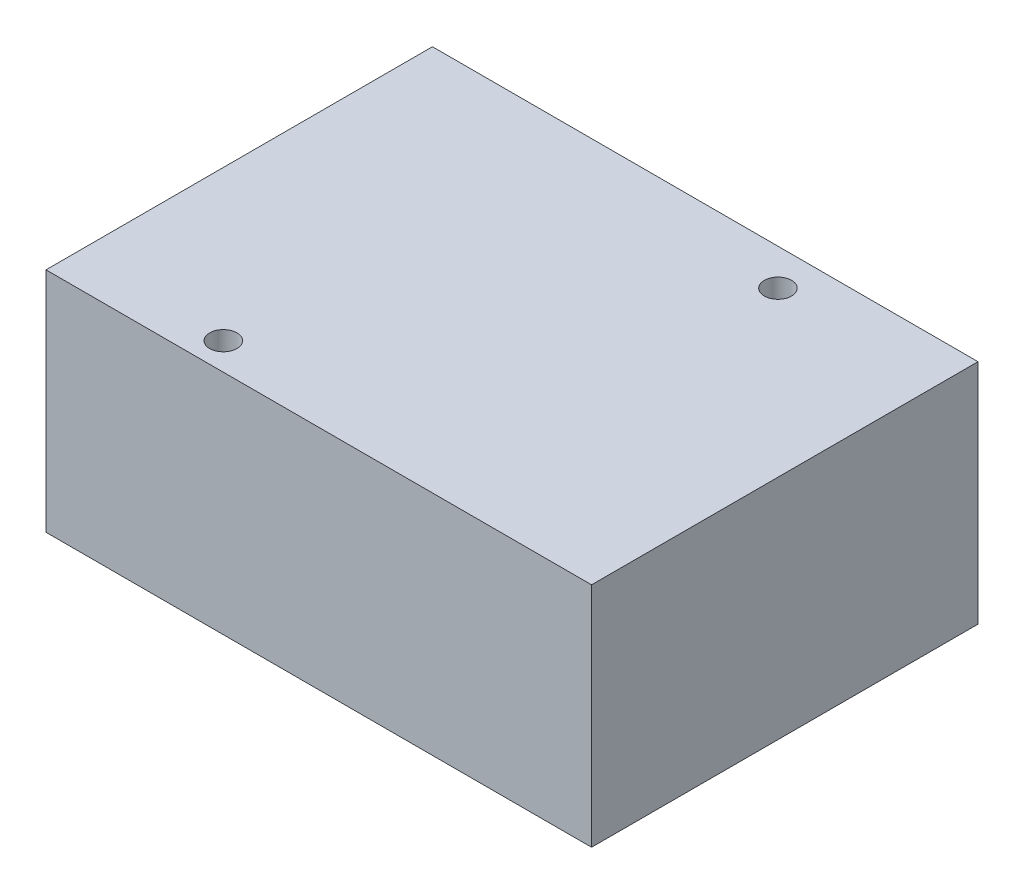
ISO-10303-21;
HEADER;
FILE_DESCRIPTION(('STEP AP214'),'2;1');
FILE_NAME('part.step','',(''),(''),'','','');
FILE_SCHEMA(('AUTOMOTIVE_DESIGN { 1 0 10303 214 1 1 1 1 }'));
ENDSEC;
DATA;
#1=APPLICATION_CONTEXT('core data for automotive mechanical design processes');
#2=APPLICATION_PROTOCOL_DEFINITION('international standard','automotive_design',2000,#1);
#3=PRODUCT_CONTEXT('',#1,'mechanical');
#4=PRODUCT('Part','Part','',(#3));
#5=PRODUCT_RELATED_PRODUCT_CATEGORY('part','',(#4));
#6=PRODUCT_DEFINITION_FORMATION('','',#4);
#7=PRODUCT_DEFINITION_CONTEXT('part definition',#1,'design');
#8=PRODUCT_DEFINITION('design','',#6,#7);
#9=PRODUCT_DEFINITION_SHAPE('','',#8);
#10=(LENGTH_UNIT() NAMED_UNIT(*) SI_UNIT(.MILLI.,.METRE.));
#11=(NAMED_UNIT(*) PLANE_ANGLE_UNIT() SI_UNIT($,.RADIAN.));
#12=(NAMED_UNIT(*) SI_UNIT($,.STERADIAN.) SOLID_ANGLE_UNIT());
#13=UNCERTAINTY_MEASURE_WITH_UNIT(LENGTH_MEASURE(1.E-05),#10,'distance_accuracy_value','');
#14=(GEOMETRIC_REPRESENTATION_CONTEXT(3) GLOBAL_UNCERTAINTY_ASSIGNED_CONTEXT((#13)) GLOBAL_UNIT_ASSIGNED_CONTEXT((#10,
#11,#12)) REPRESENTATION_CONTEXT('',''));
#15=CARTESIAN_POINT('',(0.,0.,0.));
#16=DIRECTION('',(0.,0.,1.));
#17=DIRECTION('',(1.,0.,0.));
#18=AXIS2_PLACEMENT_3D('',#15,#16,#17);
#19=CARTESIAN_POINT('',(30.,25.,-21.25));
#20=DIRECTION('',(-1.,0.,0.));
#21=DIRECTION('',(0.,0.,1.));
#22=AXIS2_PLACEMENT_3D('',#19,#20,#21);
#23=PLANE('',#22);
#24=DIRECTION('',(0.,0.,-1.));
#25=VECTOR('',#24,1.);
#26=CARTESIAN_POINT('',(30.,0.,-21.25));
#27=LINE('',#26,#25);
#28=CARTESIAN_POINT('',(30.,0.,21.25));
#29=VERTEX_POINT('',#28);
#30=CARTESIAN_POINT('',(30.,0.,-21.25));
#31=VERTEX_POINT('',#30);
#32=EDGE_CURVE('E95',#29,#31,#27,.T.);
#33=ORIENTED_EDGE('',*,*,#32,.T.);
#34=DIRECTION('',(0.,-1.,0.));
#35=VECTOR('',#34,1.);
#36=CARTESIAN_POINT('',(30.,25.,-21.25));
#37=LINE('',#36,#35);
#38=CARTESIAN_POINT('',(30.,25.,-21.25));
#39=VERTEX_POINT('',#38);
#40=EDGE_CURVE('E11',#39,#31,#37,.T.);
#41=ORIENTED_EDGE('',*,*,#40,.F.);
#42=DIRECTION('',(0.,0.,-1.));
#43=VECTOR('',#42,1.);
#44=CARTESIAN_POINT('',(30.,25.,-21.25));
#45=LINE('',#44,#43);
#46=CARTESIAN_POINT('',(30.,25.,21.25));
#47=VERTEX_POINT('',#46);
#48=EDGE_CURVE('E83',#47,#39,#45,.T.);
#49=ORIENTED_EDGE('',*,*,#48,.F.);
#50=DIRECTION('',(0.,-1.,0.));
#51=VECTOR('',#50,1.);
#52=CARTESIAN_POINT('',(30.,25.,21.25));
#53=LINE('',#52,#51);
#54=EDGE_CURVE('E91',#47,#29,#53,.T.);
#55=ORIENTED_EDGE('',*,*,#54,.T.);
#56=EDGE_LOOP('',(#33,#41,#49,#55));
#57=FACE_BOUND('',#56,.T.);
#58=ADVANCED_FACE('F32',(#57),#23,.F.);
#59=CARTESIAN_POINT('',(-30.,25.,-21.25));
#60=DIRECTION('',(0.,0.,1.));
#61=DIRECTION('',(1.,0.,0.));
#62=AXIS2_PLACEMENT_3D('',#59,#60,#61);
#63=PLANE('',#62);
#64=DIRECTION('',(-1.,0.,0.));
#65=VECTOR('',#64,1.);
#66=CARTESIAN_POINT('',(-30.,0.,-21.25));
#67=LINE('',#66,#65);
#68=CARTESIAN_POINT('',(-30.,0.,-21.25));
#69=VERTEX_POINT('',#68);
#70=EDGE_CURVE('E87',#31,#69,#67,.T.);
#71=ORIENTED_EDGE('',*,*,#70,.T.);
#72=DIRECTION('',(0.,-1.,0.));
#73=VECTOR('',#72,1.);
#74=CARTESIAN_POINT('',(-30.,25.,-21.25));
#75=LINE('',#74,#73);
#76=CARTESIAN_POINT('',(-30.,25.,-21.25));
#77=VERTEX_POINT('',#76);
#78=EDGE_CURVE('E40',#77,#69,#75,.T.);
#79=ORIENTED_EDGE('',*,*,#78,.F.);
#80=DIRECTION('',(-1.,0.,0.));
#81=VECTOR('',#80,1.);
#82=CARTESIAN_POINT('',(-30.,25.,-21.25));
#83=LINE('',#82,#81);
#84=EDGE_CURVE('E78',#39,#77,#83,.T.);
#85=ORIENTED_EDGE('',*,*,#84,.F.);
#86=ORIENTED_EDGE('',*,*,#40,.T.);
#87=EDGE_LOOP('',(#71,#79,#85,#86));
#88=FACE_BOUND('',#87,.T.);
#89=ADVANCED_FACE('F86',(#88),#63,.F.);
#90=CARTESIAN_POINT('',(-30.,25.,-21.25));
#91=DIRECTION('',(1.,0.,0.));
#92=DIRECTION('',(0.,0.,-1.));
#93=AXIS2_PLACEMENT_3D('',#90,#91,#92);
#94=PLANE('',#93);
#95=DIRECTION('',(0.,0.,1.));
#96=VECTOR('',#95,1.);
#97=CARTESIAN_POINT('',(-30.,0.,-21.25));
#98=LINE('',#97,#96);
#99=CARTESIAN_POINT('',(-30.,0.,21.25));
#100=VERTEX_POINT('',#99);
#101=EDGE_CURVE('E65',#69,#100,#98,.T.);
#102=ORIENTED_EDGE('',*,*,#101,.T.);
#103=DIRECTION('',(0.,-1.,0.));
#104=VECTOR('',#103,1.);
#105=CARTESIAN_POINT('',(-30.,25.,21.25));
#106=LINE('',#105,#104);
#107=CARTESIAN_POINT('',(-30.,25.,21.25));
#108=VERTEX_POINT('',#107);
#109=EDGE_CURVE('E88',#108,#100,#106,.T.);
#110=ORIENTED_EDGE('',*,*,#109,.F.);
#111=DIRECTION('',(0.,0.,1.));
#112=VECTOR('',#111,1.);
#113=CARTESIAN_POINT('',(-30.,25.,-21.25));
#114=LINE('',#113,#112);
#115=EDGE_CURVE('E81',#77,#108,#114,.T.);
#116=ORIENTED_EDGE('',*,*,#115,.F.);
#117=ORIENTED_EDGE('',*,*,#78,.T.);
#118=EDGE_LOOP('',(#102,#110,#116,#117));
#119=FACE_BOUND('',#118,.T.);
#120=ADVANCED_FACE('F89',(#119),#94,.F.);
#121=CARTESIAN_POINT('',(-30.,25.,21.25));
#122=DIRECTION('',(0.,0.,-1.));
#123=DIRECTION('',(-1.,0.,0.));
#124=AXIS2_PLACEMENT_3D('',#121,#122,#123);
#125=PLANE('',#124);
#126=DIRECTION('',(1.,0.,0.));
#127=VECTOR('',#126,1.);
#128=CARTESIAN_POINT('',(-30.,0.,21.25));
#129=LINE('',#128,#127);
#130=EDGE_CURVE('E71',#100,#29,#129,.T.);
#131=ORIENTED_EDGE('',*,*,#130,.T.);
#132=ORIENTED_EDGE('',*,*,#54,.F.);
#133=DIRECTION('',(1.,0.,0.));
#134=VECTOR('',#133,1.);
#135=CARTESIAN_POINT('',(-30.,25.,21.25));
#136=LINE('',#135,#134);
#137=EDGE_CURVE('E48',#108,#47,#136,.T.);
#138=ORIENTED_EDGE('',*,*,#137,.F.);
#139=ORIENTED_EDGE('',*,*,#109,.T.);
#140=EDGE_LOOP('',(#131,#132,#138,#139));
#141=FACE_BOUND('',#140,.T.);
#142=ADVANCED_FACE('F103',(#141),#125,.F.);
#143=CARTESIAN_POINT('',(0.,25.,0.));
#144=DIRECTION('',(0.,1.,0.));
#145=DIRECTION('',(0.,0.,1.));
#146=AXIS2_PLACEMENT_3D('',#143,#144,#145);
#147=PLANE('',#146);
#148=CARTESIAN_POINT('',(12.,25.,-17.25));
#149=DIRECTION('',(0.,1.,0.));
#150=DIRECTION('',(0.,0.,1.));
#151=AXIS2_PLACEMENT_3D('',#148,#149,#150);
#152=CIRCLE('',#151,1.5);
#153=CARTESIAN_POINT('',(12.,25.,-15.75));
#154=VERTEX_POINT('',#153);
#155=EDGE_CURVE('E115',#154,#154,#152,.T.);
#156=ORIENTED_EDGE('',*,*,#155,.F.);
#157=EDGE_LOOP('',(#156));
#158=FACE_BOUND('',#157,.T.);
#159=CARTESIAN_POINT('',(-13.5,25.,18.25));
#160=DIRECTION('',(0.,1.,0.));
#161=DIRECTION('',(0.,0.,1.));
#162=AXIS2_PLACEMENT_3D('',#159,#160,#161);
#163=CIRCLE('',#162,1.5);
#164=CARTESIAN_POINT('',(-13.5,25.,19.75));
#165=VERTEX_POINT('',#164);
#166=EDGE_CURVE('E109',#165,#165,#163,.T.);
#167=ORIENTED_EDGE('',*,*,#166,.F.);
#168=EDGE_LOOP('',(#167));
#169=FACE_BOUND('',#168,.T.);
#170=ORIENTED_EDGE('',*,*,#48,.T.);
#171=ORIENTED_EDGE('',*,*,#84,.T.);
#172=ORIENTED_EDGE('',*,*,#115,.T.);
#173=ORIENTED_EDGE('',*,*,#137,.T.);
#174=EDGE_LOOP('',(#170,#171,#172,#173));
#175=FACE_BOUND('',#174,.T.);
#176=ADVANCED_FACE('F79',(#158,#169,#175),#147,.T.);
#177=CARTESIAN_POINT('',(0.,0.,0.));
#178=DIRECTION('',(0.,1.,0.));
#179=DIRECTION('',(0.,0.,1.));
#180=AXIS2_PLACEMENT_3D('',#177,#178,#179);
#181=PLANE('',#180);
#182=CARTESIAN_POINT('',(12.,0.,-17.25));
#183=DIRECTION('',(0.,1.,0.));
#184=DIRECTION('',(0.,0.,1.));
#185=AXIS2_PLACEMENT_3D('',#182,#183,#184);
#186=CIRCLE('',#185,1.5);
#187=CARTESIAN_POINT('',(12.,0.,-15.75));
#188=VERTEX_POINT('',#187);
#189=EDGE_CURVE('E98',#188,#188,#186,.T.);
#190=ORIENTED_EDGE('',*,*,#189,.T.);
#191=EDGE_LOOP('',(#190));
#192=FACE_BOUND('',#191,.T.);
#193=CARTESIAN_POINT('',(-13.5,0.,18.25));
#194=DIRECTION('',(0.,1.,0.));
#195=DIRECTION('',(0.,0.,1.));
#196=AXIS2_PLACEMENT_3D('',#193,#194,#195);
#197=CIRCLE('',#196,1.5);
#198=CARTESIAN_POINT('',(-13.5,0.,19.75));
#199=VERTEX_POINT('',#198);
#200=EDGE_CURVE('E112',#199,#199,#197,.T.);
#201=ORIENTED_EDGE('',*,*,#200,.T.);
#202=EDGE_LOOP('',(#201));
#203=FACE_BOUND('',#202,.T.);
#204=ORIENTED_EDGE('',*,*,#32,.F.);
#205=ORIENTED_EDGE('',*,*,#130,.F.);
#206=ORIENTED_EDGE('',*,*,#101,.F.);
#207=ORIENTED_EDGE('',*,*,#70,.F.);
#208=EDGE_LOOP('',(#204,#205,#206,#207));
#209=FACE_BOUND('',#208,.T.);
#210=ADVANCED_FACE('F106',(#192,#203,#209),#181,.F.);
#211=CARTESIAN_POINT('',(-13.5,0.,18.25));
#212=DIRECTION('',(0.,1.,0.));
#213=DIRECTION('',(0.,0.,1.));
#214=AXIS2_PLACEMENT_3D('',#211,#212,#213);
#215=CYLINDRICAL_SURFACE('',#214,1.5);
#216=ORIENTED_EDGE('',*,*,#200,.F.);
#217=EDGE_LOOP('',(#216));
#218=FACE_BOUND('',#217,.T.);
#219=ORIENTED_EDGE('',*,*,#166,.T.);
#220=EDGE_LOOP('',(#219));
#221=FACE_BOUND('',#220,.T.);
#222=ADVANCED_FACE('F126',(#218,#221),#215,.F.);
#223=CARTESIAN_POINT('',(12.,0.,-17.25));
#224=DIRECTION('',(0.,1.,0.));
#225=DIRECTION('',(0.,0.,1.));
#226=AXIS2_PLACEMENT_3D('',#223,#224,#225);
#227=CYLINDRICAL_SURFACE('',#226,1.5);
#228=ORIENTED_EDGE('',*,*,#189,.F.);
#229=EDGE_LOOP('',(#228));
#230=FACE_BOUND('',#229,.T.);
#231=ORIENTED_EDGE('',*,*,#155,.T.);
#232=EDGE_LOOP('',(#231));
#233=FACE_BOUND('',#232,.T.);
#234=ADVANCED_FACE('F123',(#230,#233),#227,.F.);
#235=CLOSED_SHELL('',(#58,#89,#120,#142,#176,#210,#222,#234));
#236=MANIFOLD_SOLID_BREP('B2',#235);
#237=ADVANCED_BREP_SHAPE_REPRESENTATION('',(#18,#236),#14);
#238=SHAPE_DEFINITION_REPRESENTATION(#9,#237);
ENDSEC;
END-ISO-10303-21;
